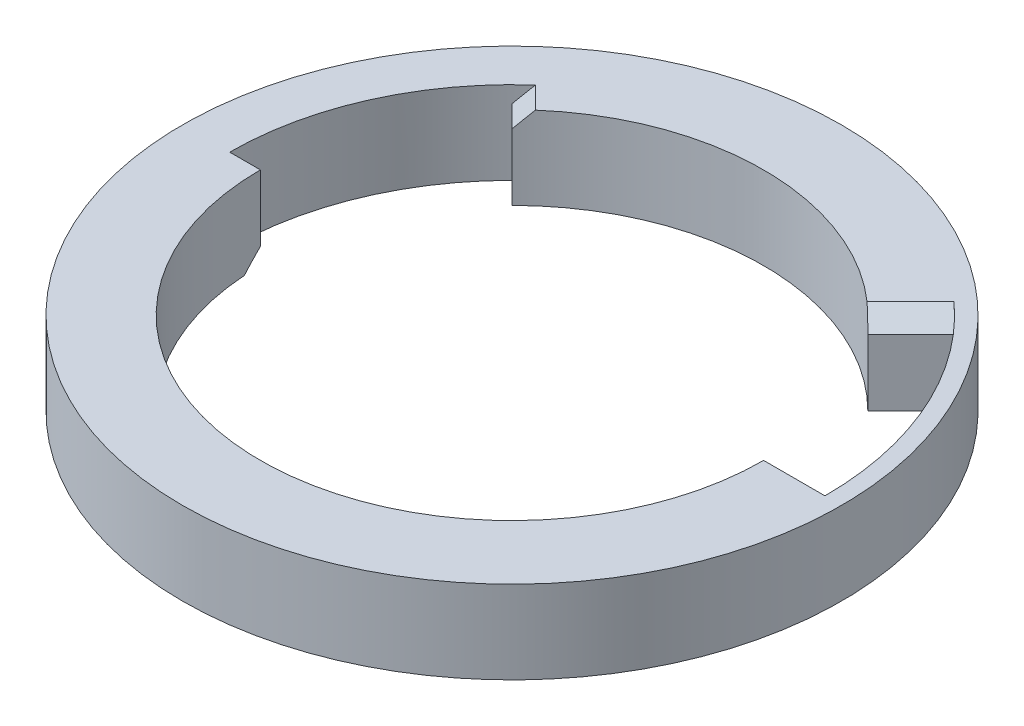
ISO-10303-21;
HEADER;
FILE_DESCRIPTION(('STEP AP214'),'2;1');
FILE_NAME('part.step','',(''),(''),'','','');
FILE_SCHEMA(('AUTOMOTIVE_DESIGN { 1 0 10303 214 1 1 1 1 }'));
ENDSEC;
DATA;
#1=APPLICATION_CONTEXT('core data for automotive mechanical design processes');
#2=APPLICATION_PROTOCOL_DEFINITION('international standard','automotive_design',2000,#1);
#3=PRODUCT_CONTEXT('',#1,'mechanical');
#4=PRODUCT('Part','Part','',(#3));
#5=PRODUCT_RELATED_PRODUCT_CATEGORY('part','',(#4));
#6=PRODUCT_DEFINITION_FORMATION('','',#4);
#7=PRODUCT_DEFINITION_CONTEXT('part definition',#1,'design');
#8=PRODUCT_DEFINITION('design','',#6,#7);
#9=PRODUCT_DEFINITION_SHAPE('','',#8);
#10=(LENGTH_UNIT() NAMED_UNIT(*) SI_UNIT(.MILLI.,.METRE.));
#11=(NAMED_UNIT(*) PLANE_ANGLE_UNIT() SI_UNIT($,.RADIAN.));
#12=(NAMED_UNIT(*) SI_UNIT($,.STERADIAN.) SOLID_ANGLE_UNIT());
#13=UNCERTAINTY_MEASURE_WITH_UNIT(LENGTH_MEASURE(1.E-05),#10,'distance_accuracy_value','');
#14=(GEOMETRIC_REPRESENTATION_CONTEXT(3) GLOBAL_UNCERTAINTY_ASSIGNED_CONTEXT((#13)) GLOBAL_UNIT_ASSIGNED_CONTEXT((#10,
#11,#12)) REPRESENTATION_CONTEXT('',''));
#15=CARTESIAN_POINT('',(0.,0.,0.));
#16=DIRECTION('',(0.,0.,1.));
#17=DIRECTION('',(1.,0.,0.));
#18=AXIS2_PLACEMENT_3D('',#15,#16,#17);
#19=CARTESIAN_POINT('',(0.,10.,0.));
#20=DIRECTION('',(0.,-1.,0.));
#21=DIRECTION('',(0.,0.,-1.));
#22=AXIS2_PLACEMENT_3D('',#19,#20,#21);
#23=CYLINDRICAL_SURFACE('',#22,39.75);
#24=CARTESIAN_POINT('',(0.,10.,0.));
#25=DIRECTION('',(0.,1.,0.));
#26=DIRECTION('',(0.,0.,1.));
#27=AXIS2_PLACEMENT_3D('',#24,#25,#26);
#28=CIRCLE('',#27,39.75);
#29=CARTESIAN_POINT('',(0.,10.,39.75));
#30=VERTEX_POINT('',#29);
#31=EDGE_CURVE('E214',#30,#30,#28,.T.);
#32=ORIENTED_EDGE('',*,*,#31,.F.);
#33=EDGE_LOOP('',(#32));
#34=FACE_BOUND('',#33,.T.);
#35=CARTESIAN_POINT('',(0.,0.,0.));
#36=DIRECTION('',(0.,1.,0.));
#37=DIRECTION('',(0.,0.,1.));
#38=AXIS2_PLACEMENT_3D('',#35,#36,#37);
#39=CIRCLE('',#38,39.75);
#40=CARTESIAN_POINT('',(0.,0.,39.75));
#41=VERTEX_POINT('',#40);
#42=EDGE_CURVE('E187',#41,#41,#39,.T.);
#43=ORIENTED_EDGE('',*,*,#42,.T.);
#44=EDGE_LOOP('',(#43));
#45=FACE_BOUND('',#44,.T.);
#46=ADVANCED_FACE('F63',(#34,#45),#23,.T.);
#47=CARTESIAN_POINT('',(0.,10.,0.));
#48=DIRECTION('',(0.,1.,0.));
#49=DIRECTION('',(0.,0.,1.));
#50=AXIS2_PLACEMENT_3D('',#47,#48,#49);
#51=PLANE('',#50);
#52=CARTESIAN_POINT('',(0.,10.,0.));
#53=DIRECTION('',(0.,1.,0.));
#54=DIRECTION('',(0.,0.,1.));
#55=AXIS2_PLACEMENT_3D('',#52,#53,#54);
#56=CIRCLE('',#55,34.05);
#57=CARTESIAN_POINT('',(-22.6212030140045,10.,-25.4496301387504));
#58=VERTEX_POINT('',#57);
#59=CARTESIAN_POINT('',(-34.05,10.,0.));
#60=VERTEX_POINT('',#59);
#61=EDGE_CURVE('E78',#58,#60,#56,.T.);
#62=ORIENTED_EDGE('',*,*,#61,.F.);
#63=DIRECTION('',(0.707106781186551,0.,0.707106781186544));
#64=VECTOR('',#63,1.);
#65=CARTESIAN_POINT('',(-20.0464772466387,10.,-22.8749043713847));
#66=LINE('',#65,#64);
#67=CARTESIAN_POINT('',(-19.9998297270201,10.,-22.8282568517661));
#68=VERTEX_POINT('',#67);
#69=EDGE_CURVE('E82',#58,#68,#66,.T.);
#70=ORIENTED_EDGE('',*,*,#69,.T.);
#71=CARTESIAN_POINT('',(0.,10.,0.));
#72=DIRECTION('',(0.,1.,0.));
#73=DIRECTION('',(0.,0.,1.));
#74=AXIS2_PLACEMENT_3D('',#71,#72,#73);
#75=CIRCLE('',#74,30.35);
#76=CARTESIAN_POINT('',(19.9998297270199,10.,-22.8282568517662));
#77=VERTEX_POINT('',#76);
#78=EDGE_CURVE('E213',#77,#68,#75,.T.);
#79=ORIENTED_EDGE('',*,*,#78,.F.);
#80=DIRECTION('',(0.707106781186547,0.,-0.707106781186548));
#81=VECTOR('',#80,1.);
#82=CARTESIAN_POINT('',(-1.41421356237312,10.,-1.41421356237311));
#83=LINE('',#82,#81);
#84=CARTESIAN_POINT('',(25.2415784911375,10.,-28.0700056158837));
#85=VERTEX_POINT('',#84);
#86=EDGE_CURVE('E237',#77,#85,#83,.T.);
#87=ORIENTED_EDGE('',*,*,#86,.T.);
#88=CARTESIAN_POINT('',(0.,10.,0.));
#89=DIRECTION('',(0.,1.,0.));
#90=DIRECTION('',(0.,0.,1.));
#91=AXIS2_PLACEMENT_3D('',#88,#89,#90);
#92=CIRCLE('',#91,37.75);
#93=CARTESIAN_POINT('',(37.75,10.,0.));
#94=VERTEX_POINT('',#93);
#95=EDGE_CURVE('E177',#94,#85,#92,.T.);
#96=ORIENTED_EDGE('',*,*,#95,.F.);
#97=DIRECTION('',(1.,0.,0.));
#98=VECTOR('',#97,1.);
#99=CARTESIAN_POINT('',(0.,10.,0.));
#100=LINE('',#99,#98);
#101=CARTESIAN_POINT('',(30.35,10.,0.));
#102=VERTEX_POINT('',#101);
#103=EDGE_CURVE('E179',#102,#94,#100,.T.);
#104=ORIENTED_EDGE('',*,*,#103,.F.);
#105=CARTESIAN_POINT('',(-30.35,10.,0.));
#106=VERTEX_POINT('',#105);
#107=EDGE_CURVE('E210',#106,#102,#75,.T.);
#108=ORIENTED_EDGE('',*,*,#107,.F.);
#109=DIRECTION('',(-1.,0.,0.));
#110=VECTOR('',#109,1.);
#111=CARTESIAN_POINT('',(0.,10.,0.));
#112=LINE('',#111,#110);
#113=EDGE_CURVE('E194',#106,#60,#112,.T.);
#114=ORIENTED_EDGE('',*,*,#113,.T.);
#115=EDGE_LOOP('',(#62,#70,#79,#87,#96,#104,#108,#114));
#116=FACE_BOUND('',#115,.T.);
#117=ORIENTED_EDGE('',*,*,#31,.T.);
#118=EDGE_LOOP('',(#117));
#119=FACE_BOUND('',#118,.T.);
#120=ADVANCED_FACE('F266',(#116,#119),#51,.T.);
#121=CARTESIAN_POINT('',(0.,0.,0.));
#122=DIRECTION('',(0.,1.,0.));
#123=DIRECTION('',(0.,0.,1.));
#124=AXIS2_PLACEMENT_3D('',#121,#122,#123);
#125=PLANE('',#124);
#126=CARTESIAN_POINT('',(0.,0.,0.));
#127=DIRECTION('',(0.,1.,0.));
#128=DIRECTION('',(0.,0.,1.));
#129=AXIS2_PLACEMENT_3D('',#126,#127,#128);
#130=CIRCLE('',#129,34.05);
#131=CARTESIAN_POINT('',(-24.0769858994021,0.,-24.0769858994018));
#132=VERTEX_POINT('',#131);
#133=CARTESIAN_POINT('',(-33.9912120996001,0.,2.00000000000002));
#134=VERTEX_POINT('',#133);
#135=EDGE_CURVE('E193',#132,#134,#130,.T.);
#136=ORIENTED_EDGE('',*,*,#135,.T.);
#137=DIRECTION('',(1.,0.,0.));
#138=VECTOR('',#137,1.);
#139=CARTESIAN_POINT('',(-30.35,0.,2.00000000000002));
#140=LINE('',#139,#138);
#141=CARTESIAN_POINT('',(-30.2840304451042,0.,2.00000000000002));
#142=VERTEX_POINT('',#141);
#143=EDGE_CURVE('E230',#134,#142,#140,.T.);
#144=ORIENTED_EDGE('',*,*,#143,.T.);
#145=CARTESIAN_POINT('',(0.,0.,0.));
#146=DIRECTION('',(0.,1.,0.));
#147=DIRECTION('',(0.,0.,1.));
#148=AXIS2_PLACEMENT_3D('',#145,#146,#147);
#149=CIRCLE('',#148,30.35);
#150=CARTESIAN_POINT('',(30.2840304451042,0.,2.00000000000002));
#151=VERTEX_POINT('',#150);
#152=EDGE_CURVE('E198',#142,#151,#149,.T.);
#153=ORIENTED_EDGE('',*,*,#152,.T.);
#154=DIRECTION('',(1.,0.,0.));
#155=VECTOR('',#154,1.);
#156=CARTESIAN_POINT('',(0.,0.,2.00000000000002));
#157=LINE('',#156,#155);
#158=CARTESIAN_POINT('',(37.6969826378717,0.,2.00000000000002));
#159=VERTEX_POINT('',#158);
#160=EDGE_CURVE('E176',#151,#159,#157,.T.);
#161=ORIENTED_EDGE('',*,*,#160,.T.);
#162=CARTESIAN_POINT('',(0.,0.,0.));
#163=DIRECTION('',(0.,1.,0.));
#164=DIRECTION('',(0.,0.,1.));
#165=AXIS2_PLACEMENT_3D('',#162,#163,#164);
#166=CIRCLE('',#165,37.75);
#167=CARTESIAN_POINT('',(26.6932809897921,0.,-26.6932809897922));
#168=VERTEX_POINT('',#167);
#169=EDGE_CURVE('E164',#159,#168,#166,.T.);
#170=ORIENTED_EDGE('',*,*,#169,.T.);
#171=DIRECTION('',(0.707106781186547,0.,-0.707106781186548));
#172=VECTOR('',#171,1.);
#173=CARTESIAN_POINT('',(0.,0.,0.));
#174=LINE('',#173,#172);
#175=CARTESIAN_POINT('',(21.4606908090117,0.,-21.4606908090118));
#176=VERTEX_POINT('',#175);
#177=EDGE_CURVE('E152',#176,#168,#174,.T.);
#178=ORIENTED_EDGE('',*,*,#177,.F.);
#179=CARTESIAN_POINT('',(-21.4606908090118,0.,-21.4606908090116));
#180=VERTEX_POINT('',#179);
#181=EDGE_CURVE('E209',#176,#180,#149,.T.);
#182=ORIENTED_EDGE('',*,*,#181,.T.);
#183=DIRECTION('',(-0.707106781186551,0.,-0.707106781186544));
#184=VECTOR('',#183,1.);
#185=CARTESIAN_POINT('',(0.,0.,0.));
#186=LINE('',#185,#184);
#187=EDGE_CURVE('E190',#180,#132,#186,.T.);
#188=ORIENTED_EDGE('',*,*,#187,.T.);
#189=EDGE_LOOP('',(#136,#144,#153,#161,#170,#178,#182,#188));
#190=FACE_BOUND('',#189,.T.);
#191=ORIENTED_EDGE('',*,*,#42,.F.);
#192=EDGE_LOOP('',(#191));
#193=FACE_BOUND('',#192,.T.);
#194=ADVANCED_FACE('F173',(#190,#193),#125,.F.);
#195=CARTESIAN_POINT('',(0.,0.,0.));
#196=DIRECTION('',(0.,0.,1.));
#197=DIRECTION('',(1.,0.,0.));
#198=AXIS2_PLACEMENT_3D('',#195,#196,#197);
#199=PLANE('',#198);
#200=DIRECTION('',(0.,1.,0.));
#201=VECTOR('',#200,1.);
#202=CARTESIAN_POINT('',(37.75,0.,0.));
#203=LINE('',#202,#201);
#204=CARTESIAN_POINT('',(37.75,2.00000000000002,0.));
#205=VERTEX_POINT('',#204);
#206=EDGE_CURVE('E163',#205,#94,#203,.T.);
#207=ORIENTED_EDGE('',*,*,#206,.F.);
#208=DIRECTION('',(-1.,0.,0.));
#209=VECTOR('',#208,1.);
#210=CARTESIAN_POINT('',(0.,2.00000000000002,0.));
#211=LINE('',#210,#209);
#212=CARTESIAN_POINT('',(30.35,2.00000000000002,0.));
#213=VERTEX_POINT('',#212);
#214=EDGE_CURVE('E220',#205,#213,#211,.T.);
#215=ORIENTED_EDGE('',*,*,#214,.T.);
#216=DIRECTION('',(0.,1.,0.));
#217=VECTOR('',#216,1.);
#218=CARTESIAN_POINT('',(30.35,0.,0.));
#219=LINE('',#218,#217);
#220=EDGE_CURVE('E185',#213,#102,#219,.T.);
#221=ORIENTED_EDGE('',*,*,#220,.T.);
#222=ORIENTED_EDGE('',*,*,#103,.T.);
#223=EDGE_LOOP('',(#207,#215,#221,#222));
#224=FACE_BOUND('',#223,.T.);
#225=ADVANCED_FACE('F273',(#224),#199,.F.);
#226=CARTESIAN_POINT('',(0.,0.,0.));
#227=DIRECTION('',(0.707106781186548,0.,0.707106781186547));
#228=DIRECTION('',(0.707106781186547,0.,-0.707106781186548));
#229=AXIS2_PLACEMENT_3D('',#226,#227,#228);
#230=PLANE('',#229);
#231=DIRECTION('',(0.,1.,0.));
#232=VECTOR('',#231,1.);
#233=CARTESIAN_POINT('',(26.6932809897921,0.,-26.6932809897922));
#234=LINE('',#233,#232);
#235=CARTESIAN_POINT('',(26.6932809897921,8.,-26.6932809897922));
#236=VERTEX_POINT('',#235);
#237=EDGE_CURVE('E155',#168,#236,#234,.T.);
#238=ORIENTED_EDGE('',*,*,#237,.T.);
#239=DIRECTION('',(-0.707106781186547,0.,0.707106781186548));
#240=VECTOR('',#239,1.);
#241=CARTESIAN_POINT('',(0.,8.,0.));
#242=LINE('',#241,#240);
#243=CARTESIAN_POINT('',(21.4606908090117,8.,-21.4606908090118));
#244=VERTEX_POINT('',#243);
#245=EDGE_CURVE('E240',#236,#244,#242,.T.);
#246=ORIENTED_EDGE('',*,*,#245,.T.);
#247=DIRECTION('',(0.,1.,0.));
#248=VECTOR('',#247,1.);
#249=CARTESIAN_POINT('',(21.4606908090117,0.,-21.4606908090118));
#250=LINE('',#249,#248);
#251=EDGE_CURVE('E158',#176,#244,#250,.T.);
#252=ORIENTED_EDGE('',*,*,#251,.F.);
#253=ORIENTED_EDGE('',*,*,#177,.T.);
#254=EDGE_LOOP('',(#238,#246,#252,#253));
#255=FACE_BOUND('',#254,.T.);
#256=ADVANCED_FACE('F154',(#255),#230,.T.);
#257=CARTESIAN_POINT('',(0.,0.,0.));
#258=DIRECTION('',(0.,1.,0.));
#259=DIRECTION('',(0.,0.,1.));
#260=AXIS2_PLACEMENT_3D('',#257,#258,#259);
#261=CYLINDRICAL_SURFACE('',#260,37.75);
#262=ORIENTED_EDGE('',*,*,#95,.T.);
#263=CARTESIAN_POINT('',(0.,7.99999999999997,0.));
#264=DIRECTION('',(-0.500000000000001,-0.707106781186547,-0.5));
#265=DIRECTION('',(-0.5,0.707106781186548,-0.499999999999999));
#266=AXIS2_PLACEMENT_3D('',#263,#264,#265);
#267=ELLIPSE('',#266,53.3865619795844,37.75);
#268=EDGE_CURVE('E170',#85,#236,#267,.T.);
#269=ORIENTED_EDGE('',*,*,#268,.T.);
#270=ORIENTED_EDGE('',*,*,#237,.F.);
#271=ORIENTED_EDGE('',*,*,#169,.F.);
#272=CARTESIAN_POINT('',(0.,2.00000000000002,0.));
#273=DIRECTION('',(0.,0.707106781186547,0.707106781186547));
#274=DIRECTION('',(0.,0.707106781186548,-0.707106781186548));
#275=AXIS2_PLACEMENT_3D('',#272,#273,#274);
#276=ELLIPSE('',#275,53.3865619795843,37.75);
#277=EDGE_CURVE('E225',#159,#205,#276,.T.);
#278=ORIENTED_EDGE('',*,*,#277,.T.);
#279=ORIENTED_EDGE('',*,*,#206,.T.);
#280=EDGE_LOOP('',(#262,#269,#270,#271,#278,#279));
#281=FACE_BOUND('',#280,.T.);
#282=ADVANCED_FACE('F167',(#281),#261,.F.);
#283=CARTESIAN_POINT('',(0.,0.,0.));
#284=DIRECTION('',(0.,1.,0.));
#285=DIRECTION('',(0.,0.,1.));
#286=AXIS2_PLACEMENT_3D('',#283,#284,#285);
#287=CYLINDRICAL_SURFACE('',#286,34.05);
#288=ORIENTED_EDGE('',*,*,#61,.T.);
#289=DIRECTION('',(0.,1.,0.));
#290=VECTOR('',#289,1.);
#291=CARTESIAN_POINT('',(-34.05,0.,0.));
#292=LINE('',#291,#290);
#293=CARTESIAN_POINT('',(-34.05,2.00000000000002,0.));
#294=VERTEX_POINT('',#293);
#295=EDGE_CURVE('E201',#294,#60,#292,.T.);
#296=ORIENTED_EDGE('',*,*,#295,.F.);
#297=CARTESIAN_POINT('',(0.,2.00000000000002,0.));
#298=DIRECTION('',(0.,-0.707106781186547,-0.707106781186547));
#299=DIRECTION('',(0.,0.707106781186548,-0.707106781186548));
#300=AXIS2_PLACEMENT_3D('',#297,#298,#299);
#301=ELLIPSE('',#300,48.1539717988039,34.05);
#302=EDGE_CURVE('E234',#294,#134,#301,.F.);
#303=ORIENTED_EDGE('',*,*,#302,.T.);
#304=ORIENTED_EDGE('',*,*,#135,.F.);
#305=DIRECTION('',(0.,1.,0.));
#306=VECTOR('',#305,1.);
#307=CARTESIAN_POINT('',(-24.0769858994021,0.,-24.0769858994018));
#308=LINE('',#307,#306);
#309=CARTESIAN_POINT('',(-24.0769858994021,7.99999999999999,-24.0769858994018));
#310=VERTEX_POINT('',#309);
#311=EDGE_CURVE('E203',#132,#310,#308,.T.);
#312=ORIENTED_EDGE('',*,*,#311,.T.);
#313=CARTESIAN_POINT('',(0.,8.00000000000002,0.));
#314=DIRECTION('',(-0.499999999999997,0.707106781186549,0.500000000000001));
#315=DIRECTION('',(0.499999999999999,0.707106781186546,-0.500000000000003));
#316=AXIS2_PLACEMENT_3D('',#313,#314,#315);
#317=ELLIPSE('',#316,48.1539717988038,34.05);
#318=EDGE_CURVE('E12',#310,#58,#317,.F.);
#319=ORIENTED_EDGE('',*,*,#318,.T.);
#320=EDGE_LOOP('',(#288,#296,#303,#304,#312,#319));
#321=FACE_BOUND('',#320,.T.);
#322=ADVANCED_FACE('F257',(#321),#287,.F.);
#323=CARTESIAN_POINT('',(0.,0.,0.));
#324=DIRECTION('',(0.,0.,-1.));
#325=DIRECTION('',(-1.,0.,0.));
#326=AXIS2_PLACEMENT_3D('',#323,#324,#325);
#327=PLANE('',#326);
#328=DIRECTION('',(0.,1.,0.));
#329=VECTOR('',#328,1.);
#330=CARTESIAN_POINT('',(-30.35,0.,0.));
#331=LINE('',#330,#329);
#332=CARTESIAN_POINT('',(-30.35,2.00000000000002,0.));
#333=VERTEX_POINT('',#332);
#334=EDGE_CURVE('E183',#333,#106,#331,.T.);
#335=ORIENTED_EDGE('',*,*,#334,.F.);
#336=DIRECTION('',(-1.,0.,0.));
#337=VECTOR('',#336,1.);
#338=CARTESIAN_POINT('',(-34.05,2.00000000000002,0.));
#339=LINE('',#338,#337);
#340=EDGE_CURVE('E227',#333,#294,#339,.T.);
#341=ORIENTED_EDGE('',*,*,#340,.T.);
#342=ORIENTED_EDGE('',*,*,#295,.T.);
#343=ORIENTED_EDGE('',*,*,#113,.F.);
#344=EDGE_LOOP('',(#335,#341,#342,#343));
#345=FACE_BOUND('',#344,.T.);
#346=ADVANCED_FACE('F282',(#345),#327,.T.);
#347=CARTESIAN_POINT('',(0.,0.,0.));
#348=DIRECTION('',(0.707106781186544,0.,-0.707106781186551));
#349=DIRECTION('',(-0.707106781186551,0.,-0.707106781186544));
#350=AXIS2_PLACEMENT_3D('',#347,#348,#349);
#351=PLANE('',#350);
#352=DIRECTION('',(0.,1.,0.));
#353=VECTOR('',#352,1.);
#354=CARTESIAN_POINT('',(-21.4606908090118,0.,-21.4606908090116));
#355=LINE('',#354,#353);
#356=CARTESIAN_POINT('',(-21.4606908090118,7.99999999999999,-21.4606908090116));
#357=VERTEX_POINT('',#356);
#358=EDGE_CURVE('E196',#180,#357,#355,.T.);
#359=ORIENTED_EDGE('',*,*,#358,.T.);
#360=DIRECTION('',(-0.707106781186551,0.,-0.707106781186544));
#361=VECTOR('',#360,1.);
#362=CARTESIAN_POINT('',(-24.0769858994021,7.99999999999999,-24.0769858994018));
#363=LINE('',#362,#361);
#364=EDGE_CURVE('E245',#357,#310,#363,.T.);
#365=ORIENTED_EDGE('',*,*,#364,.T.);
#366=ORIENTED_EDGE('',*,*,#311,.F.);
#367=ORIENTED_EDGE('',*,*,#187,.F.);
#368=EDGE_LOOP('',(#359,#365,#366,#367));
#369=FACE_BOUND('',#368,.T.);
#370=ADVANCED_FACE('F255',(#369),#351,.F.);
#371=CARTESIAN_POINT('',(0.,0.,0.));
#372=DIRECTION('',(0.,1.,0.));
#373=DIRECTION('',(0.,0.,1.));
#374=AXIS2_PLACEMENT_3D('',#371,#372,#373);
#375=CYLINDRICAL_SURFACE('',#374,30.35);
#376=ORIENTED_EDGE('',*,*,#78,.T.);
#377=CARTESIAN_POINT('',(0.,8.00000000000002,0.));
#378=DIRECTION('',(-0.499999999999997,0.707106781186549,0.500000000000001));
#379=DIRECTION('',(0.499999999999999,0.707106781186546,-0.500000000000003));
#380=AXIS2_PLACEMENT_3D('',#377,#378,#379);
#381=ELLIPSE('',#380,42.9213816180233,30.35);
#382=EDGE_CURVE('E71',#68,#357,#381,.T.);
#383=ORIENTED_EDGE('',*,*,#382,.T.);
#384=ORIENTED_EDGE('',*,*,#358,.F.);
#385=ORIENTED_EDGE('',*,*,#181,.F.);
#386=ORIENTED_EDGE('',*,*,#251,.T.);
#387=CARTESIAN_POINT('',(0.,7.99999999999997,0.));
#388=DIRECTION('',(-0.500000000000001,-0.707106781186547,-0.5));
#389=DIRECTION('',(-0.5,0.707106781186548,-0.499999999999999));
#390=AXIS2_PLACEMENT_3D('',#387,#388,#389);
#391=ELLIPSE('',#390,42.9213816180235,30.35);
#392=EDGE_CURVE('E242',#244,#77,#391,.F.);
#393=ORIENTED_EDGE('',*,*,#392,.T.);
#394=EDGE_LOOP('',(#376,#383,#384,#385,#386,#393));
#395=FACE_BOUND('',#394,.T.);
#396=ADVANCED_FACE('F250',(#395),#375,.F.);
#397=ORIENTED_EDGE('',*,*,#152,.F.);
#398=CARTESIAN_POINT('',(0.,2.00000000000002,0.));
#399=DIRECTION('',(0.,-0.707106781186547,-0.707106781186547));
#400=DIRECTION('',(0.,0.707106781186548,-0.707106781186548));
#401=AXIS2_PLACEMENT_3D('',#398,#399,#400);
#402=ELLIPSE('',#401,42.9213816180234,30.35);
#403=EDGE_CURVE('E232',#142,#333,#402,.T.);
#404=ORIENTED_EDGE('',*,*,#403,.T.);
#405=ORIENTED_EDGE('',*,*,#334,.T.);
#406=ORIENTED_EDGE('',*,*,#107,.T.);
#407=ORIENTED_EDGE('',*,*,#220,.F.);
#408=CARTESIAN_POINT('',(0.,2.00000000000002,0.));
#409=DIRECTION('',(0.,0.707106781186547,0.707106781186547));
#410=DIRECTION('',(0.,0.707106781186548,-0.707106781186548));
#411=AXIS2_PLACEMENT_3D('',#408,#409,#410);
#412=ELLIPSE('',#411,42.9213816180234,30.35);
#413=EDGE_CURVE('E222',#213,#151,#412,.F.);
#414=ORIENTED_EDGE('',*,*,#413,.T.);
#415=EDGE_LOOP('',(#397,#404,#405,#406,#407,#414));
#416=FACE_BOUND('',#415,.T.);
#417=ADVANCED_FACE('F278',(#416),#375,.F.);
#418=CARTESIAN_POINT('',(0.,0.,2.00000000000002));
#419=DIRECTION('',(0.,0.707106781186547,0.707106781186547));
#420=DIRECTION('',(1.,0.,0.));
#421=AXIS2_PLACEMENT_3D('',#418,#419,#420);
#422=PLANE('',#421);
#423=ORIENTED_EDGE('',*,*,#413,.F.);
#424=ORIENTED_EDGE('',*,*,#214,.F.);
#425=ORIENTED_EDGE('',*,*,#277,.F.);
#426=ORIENTED_EDGE('',*,*,#160,.F.);
#427=EDGE_LOOP('',(#423,#424,#425,#426));
#428=FACE_BOUND('',#427,.T.);
#429=ADVANCED_FACE('F288',(#428),#422,.F.);
#430=CARTESIAN_POINT('',(0.,2.00000000000002,0.));
#431=DIRECTION('',(0.,-0.707106781186547,-0.707106781186547));
#432=DIRECTION('',(1.,0.,0.));
#433=AXIS2_PLACEMENT_3D('',#430,#431,#432);
#434=PLANE('',#433);
#435=ORIENTED_EDGE('',*,*,#403,.F.);
#436=ORIENTED_EDGE('',*,*,#143,.F.);
#437=ORIENTED_EDGE('',*,*,#302,.F.);
#438=ORIENTED_EDGE('',*,*,#340,.F.);
#439=EDGE_LOOP('',(#435,#436,#437,#438));
#440=FACE_BOUND('',#439,.T.);
#441=ADVANCED_FACE('F286',(#440),#434,.T.);
#442=CARTESIAN_POINT('',(-1.41421356237312,10.,-1.41421356237312));
#443=DIRECTION('',(-0.500000000000001,-0.707106781186547,-0.5));
#444=DIRECTION('',(0.707106781186547,0.,-0.707106781186548));
#445=AXIS2_PLACEMENT_3D('',#442,#443,#444);
#446=PLANE('',#445);
#447=ORIENTED_EDGE('',*,*,#392,.F.);
#448=ORIENTED_EDGE('',*,*,#245,.F.);
#449=ORIENTED_EDGE('',*,*,#268,.F.);
#450=ORIENTED_EDGE('',*,*,#86,.F.);
#451=EDGE_LOOP('',(#447,#448,#449,#450));
#452=FACE_BOUND('',#451,.T.);
#453=ADVANCED_FACE('F264',(#452),#446,.F.);
#454=CARTESIAN_POINT('',(0.,8.,0.));
#455=DIRECTION('',(-0.499999999999997,0.707106781186549,0.500000000000001));
#456=DIRECTION('',(0.707106781186551,0.,0.707106781186544));
#457=AXIS2_PLACEMENT_3D('',#454,#455,#456);
#458=PLANE('',#457);
#459=ORIENTED_EDGE('',*,*,#382,.F.);
#460=ORIENTED_EDGE('',*,*,#69,.F.);
#461=ORIENTED_EDGE('',*,*,#318,.F.);
#462=ORIENTED_EDGE('',*,*,#364,.F.);
#463=EDGE_LOOP('',(#459,#460,#461,#462));
#464=FACE_BOUND('',#463,.T.);
#465=ADVANCED_FACE('F65',(#464),#458,.T.);
#466=CLOSED_SHELL('',(#46,#120,#194,#225,#256,#282,#322,#346,#370,#396,#417,#429,#441,#453,#465));
#467=MANIFOLD_SOLID_BREP('B2',#466);
#468=ADVANCED_BREP_SHAPE_REPRESENTATION('',(#18,#467),#14);
#469=SHAPE_DEFINITION_REPRESENTATION(#9,#468);
ENDSEC;
END-ISO-10303-21;
